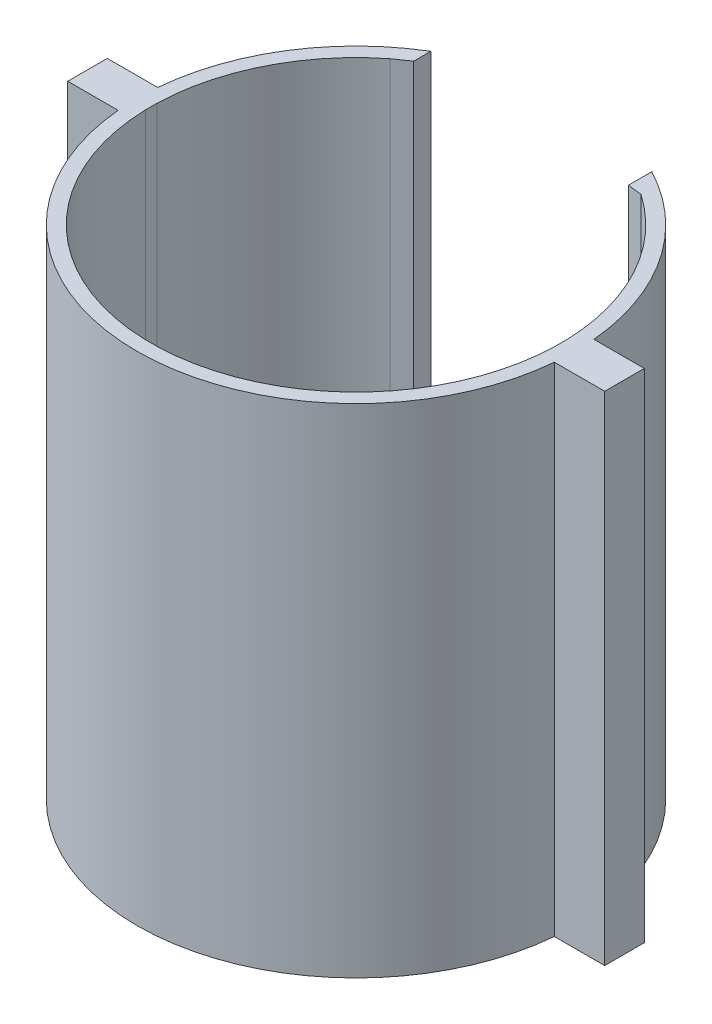
ISO-10303-21;
HEADER;
FILE_DESCRIPTION(('STEP AP214'),'2;1');
FILE_NAME('part.step','',(''),(''),'','','');
FILE_SCHEMA(('AUTOMOTIVE_DESIGN { 1 0 10303 214 1 1 1 1 }'));
ENDSEC;
DATA;
#1=APPLICATION_CONTEXT('core data for automotive mechanical design processes');
#2=APPLICATION_PROTOCOL_DEFINITION('international standard','automotive_design',2000,#1);
#3=PRODUCT_CONTEXT('',#1,'mechanical');
#4=PRODUCT('Part','Part','',(#3));
#5=PRODUCT_RELATED_PRODUCT_CATEGORY('part','',(#4));
#6=PRODUCT_DEFINITION_FORMATION('','',#4);
#7=PRODUCT_DEFINITION_CONTEXT('part definition',#1,'design');
#8=PRODUCT_DEFINITION('design','',#6,#7);
#9=PRODUCT_DEFINITION_SHAPE('','',#8);
#10=(LENGTH_UNIT() NAMED_UNIT(*) SI_UNIT(.MILLI.,.METRE.));
#11=(NAMED_UNIT(*) PLANE_ANGLE_UNIT() SI_UNIT($,.RADIAN.));
#12=(NAMED_UNIT(*) SI_UNIT($,.STERADIAN.) SOLID_ANGLE_UNIT());
#13=UNCERTAINTY_MEASURE_WITH_UNIT(LENGTH_MEASURE(1.E-05),#10,'distance_accuracy_value','');
#14=(GEOMETRIC_REPRESENTATION_CONTEXT(3) GLOBAL_UNCERTAINTY_ASSIGNED_CONTEXT((#13)) GLOBAL_UNIT_ASSIGNED_CONTEXT((#10,
#11,#12)) REPRESENTATION_CONTEXT('',''));
#15=CARTESIAN_POINT('',(0.,0.,0.));
#16=DIRECTION('',(0.,0.,1.));
#17=DIRECTION('',(1.,0.,0.));
#18=AXIS2_PLACEMENT_3D('',#15,#16,#17);
#19=CARTESIAN_POINT('',(0.,44.704,0.));
#20=DIRECTION('',(0.,-1.,0.));
#21=DIRECTION('',(0.,0.,-1.));
#22=AXIS2_PLACEMENT_3D('',#19,#20,#21);
#23=CYLINDRICAL_SURFACE('',#22,19.685);
#24=CARTESIAN_POINT('',(0.,0.,0.));
#25=DIRECTION('',(0.,1.,0.));
#26=DIRECTION('',(0.,0.,1.));
#27=AXIS2_PLACEMENT_3D('',#24,#25,#26);
#28=CIRCLE('',#27,19.685);
#29=CARTESIAN_POINT('',(-19.6045387856996,0.,1.778));
#30=VERTEX_POINT('',#29);
#31=CARTESIAN_POINT('',(19.6045387856996,0.,1.778));
#32=VERTEX_POINT('',#31);
#33=EDGE_CURVE('E268',#30,#32,#28,.T.);
#34=ORIENTED_EDGE('',*,*,#33,.T.);
#35=DIRECTION('',(0.,-1.,0.));
#36=VECTOR('',#35,1.);
#37=CARTESIAN_POINT('',(19.6045387856996,44.704,1.778));
#38=LINE('',#37,#36);
#39=CARTESIAN_POINT('',(19.6045387856996,44.704,1.778));
#40=VERTEX_POINT('',#39);
#41=EDGE_CURVE('E11',#40,#32,#38,.T.);
#42=ORIENTED_EDGE('',*,*,#41,.F.);
#43=CARTESIAN_POINT('',(0.,44.704,0.));
#44=DIRECTION('',(0.,1.,0.));
#45=DIRECTION('',(0.,0.,1.));
#46=AXIS2_PLACEMENT_3D('',#43,#44,#45);
#47=CIRCLE('',#46,19.685);
#48=CARTESIAN_POINT('',(-19.6045387856996,44.704,1.778));
#49=VERTEX_POINT('',#48);
#50=EDGE_CURVE('E223',#49,#40,#47,.T.);
#51=ORIENTED_EDGE('',*,*,#50,.F.);
#52=DIRECTION('',(0.,-1.,0.));
#53=VECTOR('',#52,1.);
#54=CARTESIAN_POINT('',(-19.6045387856996,44.704,1.778));
#55=LINE('',#54,#53);
#56=EDGE_CURVE('E224',#49,#30,#55,.T.);
#57=ORIENTED_EDGE('',*,*,#56,.T.);
#58=EDGE_LOOP('',(#34,#42,#51,#57));
#59=FACE_BOUND('',#58,.T.);
#60=ADVANCED_FACE('F47',(#59),#23,.T.);
#61=CARTESIAN_POINT('',(0.,44.704,1.778));
#62=DIRECTION('',(0.,0.,-1.));
#63=DIRECTION('',(-1.,0.,0.));
#64=AXIS2_PLACEMENT_3D('',#61,#62,#63);
#65=PLANE('',#64);
#66=DIRECTION('',(1.,0.,0.));
#67=VECTOR('',#66,1.);
#68=CARTESIAN_POINT('',(0.,0.,1.778));
#69=LINE('',#68,#67);
#70=CARTESIAN_POINT('',(24.13,0.,1.778));
#71=VERTEX_POINT('',#70);
#72=EDGE_CURVE('E262',#32,#71,#69,.T.);
#73=ORIENTED_EDGE('',*,*,#72,.T.);
#74=DIRECTION('',(0.,-1.,0.));
#75=VECTOR('',#74,1.);
#76=CARTESIAN_POINT('',(24.13,44.704,1.778));
#77=LINE('',#76,#75);
#78=CARTESIAN_POINT('',(24.13,44.704,1.778));
#79=VERTEX_POINT('',#78);
#80=EDGE_CURVE('E55',#79,#71,#77,.T.);
#81=ORIENTED_EDGE('',*,*,#80,.F.);
#82=DIRECTION('',(1.,0.,0.));
#83=VECTOR('',#82,1.);
#84=CARTESIAN_POINT('',(0.,44.704,1.778));
#85=LINE('',#84,#83);
#86=EDGE_CURVE('E302',#40,#79,#85,.T.);
#87=ORIENTED_EDGE('',*,*,#86,.F.);
#88=ORIENTED_EDGE('',*,*,#41,.T.);
#89=EDGE_LOOP('',(#73,#81,#87,#88));
#90=FACE_BOUND('',#89,.T.);
#91=ADVANCED_FACE('F406',(#90),#65,.F.);
#92=CARTESIAN_POINT('',(24.13,44.704,0.));
#93=DIRECTION('',(-1.,0.,0.));
#94=DIRECTION('',(0.,0.,1.));
#95=AXIS2_PLACEMENT_3D('',#92,#93,#94);
#96=PLANE('',#95);
#97=DIRECTION('',(0.,0.,-1.));
#98=VECTOR('',#97,1.);
#99=CARTESIAN_POINT('',(24.13,0.,0.));
#100=LINE('',#99,#98);
#101=CARTESIAN_POINT('',(24.13,0.,-1.778));
#102=VERTEX_POINT('',#101);
#103=EDGE_CURVE('E257',#71,#102,#100,.T.);
#104=ORIENTED_EDGE('',*,*,#103,.T.);
#105=DIRECTION('',(0.,-1.,0.));
#106=VECTOR('',#105,1.);
#107=CARTESIAN_POINT('',(24.13,44.704,-1.778));
#108=LINE('',#107,#106);
#109=CARTESIAN_POINT('',(24.13,44.704,-1.778));
#110=VERTEX_POINT('',#109);
#111=EDGE_CURVE('E246',#110,#102,#108,.T.);
#112=ORIENTED_EDGE('',*,*,#111,.F.);
#113=DIRECTION('',(0.,0.,-1.));
#114=VECTOR('',#113,1.);
#115=CARTESIAN_POINT('',(24.13,44.704,0.));
#116=LINE('',#115,#114);
#117=EDGE_CURVE('E259',#79,#110,#116,.T.);
#118=ORIENTED_EDGE('',*,*,#117,.F.);
#119=ORIENTED_EDGE('',*,*,#80,.T.);
#120=EDGE_LOOP('',(#104,#112,#118,#119));
#121=FACE_BOUND('',#120,.T.);
#122=ADVANCED_FACE('F255',(#121),#96,.F.);
#123=CARTESIAN_POINT('',(0.,44.704,-1.778));
#124=DIRECTION('',(0.,0.,-1.));
#125=DIRECTION('',(-1.,0.,0.));
#126=AXIS2_PLACEMENT_3D('',#123,#124,#125);
#127=PLANE('',#126);
#128=DIRECTION('',(1.,0.,0.));
#129=VECTOR('',#128,1.);
#130=CARTESIAN_POINT('',(0.,0.,-1.778));
#131=LINE('',#130,#129);
#132=CARTESIAN_POINT('',(19.6045387856996,0.,-1.778));
#133=VERTEX_POINT('',#132);
#134=EDGE_CURVE('E208',#133,#102,#131,.T.);
#135=ORIENTED_EDGE('',*,*,#134,.F.);
#136=DIRECTION('',(0.,-1.,0.));
#137=VECTOR('',#136,1.);
#138=CARTESIAN_POINT('',(19.6045387856996,44.704,-1.778));
#139=LINE('',#138,#137);
#140=CARTESIAN_POINT('',(19.6045387856996,44.704,-1.778));
#141=VERTEX_POINT('',#140);
#142=EDGE_CURVE('E243',#141,#133,#139,.T.);
#143=ORIENTED_EDGE('',*,*,#142,.F.);
#144=DIRECTION('',(1.,0.,0.));
#145=VECTOR('',#144,1.);
#146=CARTESIAN_POINT('',(0.,44.704,-1.778));
#147=LINE('',#146,#145);
#148=EDGE_CURVE('E296',#141,#110,#147,.T.);
#149=ORIENTED_EDGE('',*,*,#148,.T.);
#150=ORIENTED_EDGE('',*,*,#111,.T.);
#151=EDGE_LOOP('',(#135,#143,#149,#150));
#152=FACE_BOUND('',#151,.T.);
#153=ADVANCED_FACE('F397',(#152),#127,.T.);
#154=CARTESIAN_POINT('',(0.,44.704,0.));
#155=DIRECTION('',(0.,-1.,0.));
#156=DIRECTION('',(0.,0.,-1.));
#157=AXIS2_PLACEMENT_3D('',#154,#155,#156);
#158=CYLINDRICAL_SURFACE('',#157,19.685);
#159=CARTESIAN_POINT('',(0.,0.,0.));
#160=DIRECTION('',(0.,1.,0.));
#161=DIRECTION('',(0.,0.,1.));
#162=AXIS2_PLACEMENT_3D('',#159,#160,#161);
#163=CIRCLE('',#162,19.685);
#164=CARTESIAN_POINT('',(9.15893131399782,0.,-17.4245000555388));
#165=VERTEX_POINT('',#164);
#166=EDGE_CURVE('E202',#133,#165,#163,.T.);
#167=ORIENTED_EDGE('',*,*,#166,.T.);
#168=DIRECTION('',(0.,-1.,0.));
#169=VECTOR('',#168,1.);
#170=CARTESIAN_POINT('',(9.15893131399782,44.704,-17.4245000555388));
#171=LINE('',#170,#169);
#172=CARTESIAN_POINT('',(9.15893131399782,44.704,-17.4245000555388));
#173=VERTEX_POINT('',#172);
#174=EDGE_CURVE('E199',#173,#165,#171,.T.);
#175=ORIENTED_EDGE('',*,*,#174,.F.);
#176=CARTESIAN_POINT('',(0.,44.704,0.));
#177=DIRECTION('',(0.,1.,0.));
#178=DIRECTION('',(0.,0.,1.));
#179=AXIS2_PLACEMENT_3D('',#176,#177,#178);
#180=CIRCLE('',#179,19.685);
#181=EDGE_CURVE('E293',#141,#173,#180,.T.);
#182=ORIENTED_EDGE('',*,*,#181,.F.);
#183=ORIENTED_EDGE('',*,*,#142,.T.);
#184=EDGE_LOOP('',(#167,#175,#182,#183));
#185=FACE_BOUND('',#184,.T.);
#186=ADVANCED_FACE('F395',(#185),#158,.T.);
#187=CARTESIAN_POINT('',(9.15893131399782,44.704,0.));
#188=DIRECTION('',(1.,0.,0.));
#189=DIRECTION('',(0.,0.,-1.));
#190=AXIS2_PLACEMENT_3D('',#187,#188,#189);
#191=PLANE('',#190);
#192=DIRECTION('',(0.,0.,1.));
#193=VECTOR('',#192,1.);
#194=CARTESIAN_POINT('',(9.15893131399782,0.,0.));
#195=LINE('',#194,#193);
#196=CARTESIAN_POINT('',(9.15893131399782,0.,-15.3342891279983));
#197=VERTEX_POINT('',#196);
#198=EDGE_CURVE('E191',#165,#197,#195,.T.);
#199=ORIENTED_EDGE('',*,*,#198,.T.);
#200=DIRECTION('',(0.,1.,0.));
#201=VECTOR('',#200,1.);
#202=CARTESIAN_POINT('',(9.15893131399782,0.,-15.3342891279983));
#203=LINE('',#202,#201);
#204=CARTESIAN_POINT('',(9.15893131399782,44.704,-15.3342891279983));
#205=VERTEX_POINT('',#204);
#206=EDGE_CURVE('E172',#197,#205,#203,.T.);
#207=ORIENTED_EDGE('',*,*,#206,.T.);
#208=DIRECTION('',(0.,0.,1.));
#209=VECTOR('',#208,1.);
#210=CARTESIAN_POINT('',(9.15893131399782,44.704,0.));
#211=LINE('',#210,#209);
#212=EDGE_CURVE('E290',#173,#205,#211,.T.);
#213=ORIENTED_EDGE('',*,*,#212,.F.);
#214=ORIENTED_EDGE('',*,*,#174,.T.);
#215=EDGE_LOOP('',(#199,#207,#213,#214));
#216=FACE_BOUND('',#215,.T.);
#217=ADVANCED_FACE('F197',(#216),#191,.F.);
#218=CARTESIAN_POINT('',(-10.1450686860022,44.704,0.));
#219=DIRECTION('',(1.,0.,0.));
#220=DIRECTION('',(0.,0.,-1.));
#221=AXIS2_PLACEMENT_3D('',#218,#219,#220);
#222=PLANE('',#221);
#223=DIRECTION('',(0.,1.,0.));
#224=VECTOR('',#223,1.);
#225=CARTESIAN_POINT('',(-10.1450686860022,0.,-15.3342891279983));
#226=LINE('',#225,#224);
#227=CARTESIAN_POINT('',(-10.1450686860022,0.,-15.3342891279983));
#228=VERTEX_POINT('',#227);
#229=CARTESIAN_POINT('',(-10.1450686860022,44.704,-15.3342891279983));
#230=VERTEX_POINT('',#229);
#231=EDGE_CURVE('E183',#228,#230,#226,.T.);
#232=ORIENTED_EDGE('',*,*,#231,.F.);
#233=DIRECTION('',(0.,0.,1.));
#234=VECTOR('',#233,1.);
#235=CARTESIAN_POINT('',(-10.1450686860022,0.,0.));
#236=LINE('',#235,#234);
#237=CARTESIAN_POINT('',(-10.1450686860022,0.,-16.8694044458095));
#238=VERTEX_POINT('',#237);
#239=EDGE_CURVE('E201',#238,#228,#236,.T.);
#240=ORIENTED_EDGE('',*,*,#239,.F.);
#241=DIRECTION('',(0.,-1.,0.));
#242=VECTOR('',#241,1.);
#243=CARTESIAN_POINT('',(-10.1450686860022,44.704,-16.8694044458095));
#244=LINE('',#243,#242);
#245=CARTESIAN_POINT('',(-10.1450686860022,44.704,-16.8694044458095));
#246=VERTEX_POINT('',#245);
#247=EDGE_CURVE('E238',#246,#238,#244,.T.);
#248=ORIENTED_EDGE('',*,*,#247,.F.);
#249=DIRECTION('',(0.,0.,1.));
#250=VECTOR('',#249,1.);
#251=CARTESIAN_POINT('',(-10.1450686860022,44.704,0.));
#252=LINE('',#251,#250);
#253=EDGE_CURVE('E286',#246,#230,#252,.T.);
#254=ORIENTED_EDGE('',*,*,#253,.T.);
#255=EDGE_LOOP('',(#232,#240,#248,#254));
#256=FACE_BOUND('',#255,.T.);
#257=ADVANCED_FACE('F433',(#256),#222,.T.);
#258=CARTESIAN_POINT('',(-19.6045387856996,0.,-1.778));
#259=VERTEX_POINT('',#258);
#260=EDGE_CURVE('E206',#238,#259,#163,.T.);
#261=ORIENTED_EDGE('',*,*,#260,.T.);
#262=DIRECTION('',(0.,-1.,0.));
#263=VECTOR('',#262,1.);
#264=CARTESIAN_POINT('',(-19.6045387856996,44.704,-1.778));
#265=LINE('',#264,#263);
#266=CARTESIAN_POINT('',(-19.6045387856996,44.704,-1.778));
#267=VERTEX_POINT('',#266);
#268=EDGE_CURVE('E235',#267,#259,#265,.T.);
#269=ORIENTED_EDGE('',*,*,#268,.F.);
#270=EDGE_CURVE('E285',#246,#267,#180,.T.);
#271=ORIENTED_EDGE('',*,*,#270,.F.);
#272=ORIENTED_EDGE('',*,*,#247,.T.);
#273=EDGE_LOOP('',(#261,#269,#271,#272));
#274=FACE_BOUND('',#273,.T.);
#275=ADVANCED_FACE('F405',(#274),#158,.T.);
#276=CARTESIAN_POINT('',(0.,44.704,-1.778));
#277=DIRECTION('',(0.,0.,-1.));
#278=DIRECTION('',(-1.,0.,0.));
#279=AXIS2_PLACEMENT_3D('',#276,#277,#278);
#280=PLANE('',#279);
#281=DIRECTION('',(1.,0.,0.));
#282=VECTOR('',#281,1.);
#283=CARTESIAN_POINT('',(0.,0.,-1.778));
#284=LINE('',#283,#282);
#285=CARTESIAN_POINT('',(-24.13,0.,-1.778));
#286=VERTEX_POINT('',#285);
#287=EDGE_CURVE('E212',#286,#259,#284,.T.);
#288=ORIENTED_EDGE('',*,*,#287,.F.);
#289=DIRECTION('',(0.,-1.,0.));
#290=VECTOR('',#289,1.);
#291=CARTESIAN_POINT('',(-24.13,44.704,-1.778));
#292=LINE('',#291,#290);
#293=CARTESIAN_POINT('',(-24.13,44.704,-1.778));
#294=VERTEX_POINT('',#293);
#295=EDGE_CURVE('E232',#294,#286,#292,.T.);
#296=ORIENTED_EDGE('',*,*,#295,.F.);
#297=DIRECTION('',(1.,0.,0.));
#298=VECTOR('',#297,1.);
#299=CARTESIAN_POINT('',(0.,44.704,-1.778));
#300=LINE('',#299,#298);
#301=EDGE_CURVE('E281',#294,#267,#300,.T.);
#302=ORIENTED_EDGE('',*,*,#301,.T.);
#303=ORIENTED_EDGE('',*,*,#268,.T.);
#304=EDGE_LOOP('',(#288,#296,#302,#303));
#305=FACE_BOUND('',#304,.T.);
#306=ADVANCED_FACE('F427',(#305),#280,.T.);
#307=CARTESIAN_POINT('',(-24.13,44.704,0.));
#308=DIRECTION('',(-1.,0.,0.));
#309=DIRECTION('',(0.,0.,1.));
#310=AXIS2_PLACEMENT_3D('',#307,#308,#309);
#311=PLANE('',#310);
#312=DIRECTION('',(0.,0.,-1.));
#313=VECTOR('',#312,1.);
#314=CARTESIAN_POINT('',(-24.13,0.,0.));
#315=LINE('',#314,#313);
#316=CARTESIAN_POINT('',(-24.13,0.,1.778));
#317=VERTEX_POINT('',#316);
#318=EDGE_CURVE('E216',#317,#286,#315,.T.);
#319=ORIENTED_EDGE('',*,*,#318,.F.);
#320=DIRECTION('',(0.,-1.,0.));
#321=VECTOR('',#320,1.);
#322=CARTESIAN_POINT('',(-24.13,44.704,1.778));
#323=LINE('',#322,#321);
#324=CARTESIAN_POINT('',(-24.13,44.704,1.778));
#325=VERTEX_POINT('',#324);
#326=EDGE_CURVE('E228',#325,#317,#323,.T.);
#327=ORIENTED_EDGE('',*,*,#326,.F.);
#328=DIRECTION('',(0.,0.,-1.));
#329=VECTOR('',#328,1.);
#330=CARTESIAN_POINT('',(-24.13,44.704,0.));
#331=LINE('',#330,#329);
#332=EDGE_CURVE('E277',#325,#294,#331,.T.);
#333=ORIENTED_EDGE('',*,*,#332,.T.);
#334=ORIENTED_EDGE('',*,*,#295,.T.);
#335=EDGE_LOOP('',(#319,#327,#333,#334));
#336=FACE_BOUND('',#335,.T.);
#337=ADVANCED_FACE('F421',(#336),#311,.T.);
#338=CARTESIAN_POINT('',(0.,44.704,1.778));
#339=DIRECTION('',(0.,0.,-1.));
#340=DIRECTION('',(-1.,0.,0.));
#341=AXIS2_PLACEMENT_3D('',#338,#339,#340);
#342=PLANE('',#341);
#343=DIRECTION('',(1.,0.,0.));
#344=VECTOR('',#343,1.);
#345=CARTESIAN_POINT('',(0.,0.,1.778));
#346=LINE('',#345,#344);
#347=EDGE_CURVE('E220',#317,#30,#346,.T.);
#348=ORIENTED_EDGE('',*,*,#347,.T.);
#349=ORIENTED_EDGE('',*,*,#56,.F.);
#350=DIRECTION('',(1.,0.,0.));
#351=VECTOR('',#350,1.);
#352=CARTESIAN_POINT('',(0.,44.704,1.778));
#353=LINE('',#352,#351);
#354=EDGE_CURVE('E229',#325,#49,#353,.T.);
#355=ORIENTED_EDGE('',*,*,#354,.F.);
#356=ORIENTED_EDGE('',*,*,#326,.T.);
#357=EDGE_LOOP('',(#348,#349,#355,#356));
#358=FACE_BOUND('',#357,.T.);
#359=ADVANCED_FACE('F466',(#358),#342,.F.);
#360=CARTESIAN_POINT('',(0.,44.704,0.));
#361=DIRECTION('',(0.,1.,0.));
#362=DIRECTION('',(0.,0.,1.));
#363=AXIS2_PLACEMENT_3D('',#360,#361,#362);
#364=PLANE('',#363);
#365=DIRECTION('',(-0.820721689293798,0.,0.571328197031036));
#366=VECTOR('',#365,1.);
#367=CARTESIAN_POINT('',(-11.4150686860022,44.704,-14.4502052543849));
#368=LINE('',#367,#366);
#369=CARTESIAN_POINT('',(-11.4150686860022,44.704,-14.4502052543849));
#370=VERTEX_POINT('',#369);
#371=EDGE_CURVE('E194',#230,#370,#368,.T.);
#372=ORIENTED_EDGE('',*,*,#371,.F.);
#373=ORIENTED_EDGE('',*,*,#253,.F.);
#374=ORIENTED_EDGE('',*,*,#270,.T.);
#375=ORIENTED_EDGE('',*,*,#301,.F.);
#376=ORIENTED_EDGE('',*,*,#332,.F.);
#377=ORIENTED_EDGE('',*,*,#354,.T.);
#378=ORIENTED_EDGE('',*,*,#50,.T.);
#379=ORIENTED_EDGE('',*,*,#86,.T.);
#380=ORIENTED_EDGE('',*,*,#117,.T.);
#381=ORIENTED_EDGE('',*,*,#148,.F.);
#382=ORIENTED_EDGE('',*,*,#181,.T.);
#383=ORIENTED_EDGE('',*,*,#212,.T.);
#384=DIRECTION('',(-0.992443744325037,0.,-0.122700506723084));
#385=VECTOR('',#384,1.);
#386=CARTESIAN_POINT('',(9.15893131399782,44.704,-15.3342891279983));
#387=LINE('',#386,#385);
#388=CARTESIAN_POINT('',(10.4289313139978,44.704,-15.1772730306836));
#389=VERTEX_POINT('',#388);
#390=EDGE_CURVE('E177',#389,#205,#387,.T.);
#391=ORIENTED_EDGE('',*,*,#390,.F.);
#392=CARTESIAN_POINT('',(0.,44.704,0.));
#393=DIRECTION('',(0.,1.,0.));
#394=DIRECTION('',(0.,0.,1.));
#395=AXIS2_PLACEMENT_3D('',#392,#393,#394);
#396=CIRCLE('',#395,18.415);
#397=CARTESIAN_POINT('',(18.4079917698808,44.704,-0.508000000000002));
#398=VERTEX_POINT('',#397);
#399=EDGE_CURVE('E336',#398,#389,#396,.T.);
#400=ORIENTED_EDGE('',*,*,#399,.F.);
#401=DIRECTION('',(0.,0.,-1.));
#402=VECTOR('',#401,1.);
#403=CARTESIAN_POINT('',(18.4079917698808,44.704,-0.508));
#404=LINE('',#403,#402);
#405=CARTESIAN_POINT('',(18.4079917698808,44.704,0.508));
#406=VERTEX_POINT('',#405);
#407=EDGE_CURVE('E340',#406,#398,#404,.T.);
#408=ORIENTED_EDGE('',*,*,#407,.F.);
#409=CARTESIAN_POINT('',(0.,44.704,0.));
#410=DIRECTION('',(0.,1.,0.));
#411=DIRECTION('',(0.,0.,1.));
#412=AXIS2_PLACEMENT_3D('',#409,#410,#411);
#413=CIRCLE('',#412,18.415);
#414=CARTESIAN_POINT('',(-18.4079917698808,44.704,0.508));
#415=VERTEX_POINT('',#414);
#416=EDGE_CURVE('E62',#415,#406,#413,.T.);
#417=ORIENTED_EDGE('',*,*,#416,.F.);
#418=DIRECTION('',(0.,0.,1.));
#419=VECTOR('',#418,1.);
#420=CARTESIAN_POINT('',(-18.4079917698808,44.704,-0.508));
#421=LINE('',#420,#419);
#422=CARTESIAN_POINT('',(-18.4079917698808,44.704,-0.508));
#423=VERTEX_POINT('',#422);
#424=EDGE_CURVE('E327',#423,#415,#421,.T.);
#425=ORIENTED_EDGE('',*,*,#424,.F.);
#426=CARTESIAN_POINT('',(0.,44.704,0.));
#427=DIRECTION('',(0.,1.,0.));
#428=DIRECTION('',(0.,0.,1.));
#429=AXIS2_PLACEMENT_3D('',#426,#427,#428);
#430=CIRCLE('',#429,18.415);
#431=EDGE_CURVE('E332',#370,#423,#430,.T.);
#432=ORIENTED_EDGE('',*,*,#431,.F.);
#433=EDGE_LOOP('',(#372,#373,#374,#375,#376,#377,#378,#379,#380,#381,#382,#383,#391,#400,#408,
#417,#425,#432));
#434=FACE_BOUND('',#433,.T.);
#435=ADVANCED_FACE('F391',(#434),#364,.T.);
#436=CARTESIAN_POINT('',(0.,0.,0.));
#437=DIRECTION('',(0.,1.,0.));
#438=DIRECTION('',(0.,0.,1.));
#439=AXIS2_PLACEMENT_3D('',#436,#437,#438);
#440=PLANE('',#439);
#441=ORIENTED_EDGE('',*,*,#239,.T.);
#442=DIRECTION('',(-0.820721689293798,0.,0.571328197031036));
#443=VECTOR('',#442,1.);
#444=CARTESIAN_POINT('',(-11.4150686860022,0.,-14.4502052543849));
#445=LINE('',#444,#443);
#446=CARTESIAN_POINT('',(-11.4150686860022,0.,-14.4502052543849));
#447=VERTEX_POINT('',#446);
#448=EDGE_CURVE('E184',#228,#447,#445,.T.);
#449=ORIENTED_EDGE('',*,*,#448,.T.);
#450=CARTESIAN_POINT('',(0.,0.,0.));
#451=DIRECTION('',(0.,1.,0.));
#452=DIRECTION('',(0.,0.,1.));
#453=AXIS2_PLACEMENT_3D('',#450,#451,#452);
#454=CIRCLE('',#453,18.415);
#455=CARTESIAN_POINT('',(-18.4079917698808,0.,-0.508));
#456=VERTEX_POINT('',#455);
#457=EDGE_CURVE('E349',#447,#456,#454,.T.);
#458=ORIENTED_EDGE('',*,*,#457,.T.);
#459=DIRECTION('',(0.,0.,1.));
#460=VECTOR('',#459,1.);
#461=CARTESIAN_POINT('',(-18.4079917698808,0.,-0.508));
#462=LINE('',#461,#460);
#463=CARTESIAN_POINT('',(-18.4079917698808,0.,0.508));
#464=VERTEX_POINT('',#463);
#465=EDGE_CURVE('E312',#456,#464,#462,.T.);
#466=ORIENTED_EDGE('',*,*,#465,.T.);
#467=CARTESIAN_POINT('',(0.,0.,0.));
#468=DIRECTION('',(0.,1.,0.));
#469=DIRECTION('',(0.,0.,1.));
#470=AXIS2_PLACEMENT_3D('',#467,#468,#469);
#471=CIRCLE('',#470,18.415);
#472=CARTESIAN_POINT('',(18.4079917698808,0.,0.508));
#473=VERTEX_POINT('',#472);
#474=EDGE_CURVE('E331',#464,#473,#471,.T.);
#475=ORIENTED_EDGE('',*,*,#474,.T.);
#476=DIRECTION('',(0.,0.,-1.));
#477=VECTOR('',#476,1.);
#478=CARTESIAN_POINT('',(18.4079917698808,0.,-0.508));
#479=LINE('',#478,#477);
#480=CARTESIAN_POINT('',(18.4079917698808,0.,-0.508000000000002));
#481=VERTEX_POINT('',#480);
#482=EDGE_CURVE('E355',#473,#481,#479,.T.);
#483=ORIENTED_EDGE('',*,*,#482,.T.);
#484=CARTESIAN_POINT('',(0.,0.,0.));
#485=DIRECTION('',(0.,1.,0.));
#486=DIRECTION('',(0.,0.,1.));
#487=AXIS2_PLACEMENT_3D('',#484,#485,#486);
#488=CIRCLE('',#487,18.415);
#489=CARTESIAN_POINT('',(10.4289313139978,0.,-15.1772730306836));
#490=VERTEX_POINT('',#489);
#491=EDGE_CURVE('E70',#481,#490,#488,.T.);
#492=ORIENTED_EDGE('',*,*,#491,.T.);
#493=DIRECTION('',(-0.992443744325037,0.,-0.122700506723084));
#494=VECTOR('',#493,1.);
#495=CARTESIAN_POINT('',(9.15893131399782,0.,-15.3342891279983));
#496=LINE('',#495,#494);
#497=EDGE_CURVE('E175',#490,#197,#496,.T.);
#498=ORIENTED_EDGE('',*,*,#497,.T.);
#499=ORIENTED_EDGE('',*,*,#198,.F.);
#500=ORIENTED_EDGE('',*,*,#166,.F.);
#501=ORIENTED_EDGE('',*,*,#134,.T.);
#502=ORIENTED_EDGE('',*,*,#103,.F.);
#503=ORIENTED_EDGE('',*,*,#72,.F.);
#504=ORIENTED_EDGE('',*,*,#33,.F.);
#505=ORIENTED_EDGE('',*,*,#347,.F.);
#506=ORIENTED_EDGE('',*,*,#318,.T.);
#507=ORIENTED_EDGE('',*,*,#287,.T.);
#508=ORIENTED_EDGE('',*,*,#260,.F.);
#509=EDGE_LOOP('',(#441,#449,#458,#466,#475,#483,#492,#498,#499,#500,#501,#502,#503,#504,#505,
#506,#507,#508));
#510=FACE_BOUND('',#509,.T.);
#511=ADVANCED_FACE('F189',(#510),#440,.F.);
#512=CARTESIAN_POINT('',(0.,0.,0.));
#513=DIRECTION('',(0.,1.,0.));
#514=DIRECTION('',(0.,0.,1.));
#515=AXIS2_PLACEMENT_3D('',#512,#513,#514);
#516=CYLINDRICAL_SURFACE('',#515,18.415);
#517=ORIENTED_EDGE('',*,*,#416,.T.);
#518=DIRECTION('',(0.,1.,0.));
#519=VECTOR('',#518,1.);
#520=CARTESIAN_POINT('',(18.4079917698808,0.,0.508));
#521=LINE('',#520,#519);
#522=EDGE_CURVE('E308',#473,#406,#521,.T.);
#523=ORIENTED_EDGE('',*,*,#522,.F.);
#524=ORIENTED_EDGE('',*,*,#474,.F.);
#525=DIRECTION('',(0.,1.,0.));
#526=VECTOR('',#525,1.);
#527=CARTESIAN_POINT('',(-18.4079917698808,0.,0.508));
#528=LINE('',#527,#526);
#529=EDGE_CURVE('E274',#464,#415,#528,.T.);
#530=ORIENTED_EDGE('',*,*,#529,.T.);
#531=EDGE_LOOP('',(#517,#523,#524,#530));
#532=FACE_BOUND('',#531,.T.);
#533=ADVANCED_FACE('F383',(#532),#516,.F.);
#534=CARTESIAN_POINT('',(-18.4079917698808,0.,-0.508));
#535=DIRECTION('',(-1.,0.,0.));
#536=DIRECTION('',(0.,0.,1.));
#537=AXIS2_PLACEMENT_3D('',#534,#535,#536);
#538=PLANE('',#537);
#539=ORIENTED_EDGE('',*,*,#424,.T.);
#540=ORIENTED_EDGE('',*,*,#529,.F.);
#541=ORIENTED_EDGE('',*,*,#465,.F.);
#542=DIRECTION('',(0.,1.,0.));
#543=VECTOR('',#542,1.);
#544=CARTESIAN_POINT('',(-18.4079917698808,0.,-0.508));
#545=LINE('',#544,#543);
#546=EDGE_CURVE('E322',#456,#423,#545,.T.);
#547=ORIENTED_EDGE('',*,*,#546,.T.);
#548=EDGE_LOOP('',(#539,#540,#541,#547));
#549=FACE_BOUND('',#548,.T.);
#550=ADVANCED_FACE('F380',(#549),#538,.F.);
#551=CARTESIAN_POINT('',(0.,0.,0.));
#552=DIRECTION('',(0.,1.,0.));
#553=DIRECTION('',(0.,0.,1.));
#554=AXIS2_PLACEMENT_3D('',#551,#552,#553);
#555=CYLINDRICAL_SURFACE('',#554,18.415);
#556=ORIENTED_EDGE('',*,*,#431,.T.);
#557=ORIENTED_EDGE('',*,*,#546,.F.);
#558=ORIENTED_EDGE('',*,*,#457,.F.);
#559=DIRECTION('',(0.,1.,0.));
#560=VECTOR('',#559,1.);
#561=CARTESIAN_POINT('',(-11.4150686860022,0.,-14.4502052543849));
#562=LINE('',#561,#560);
#563=EDGE_CURVE('E318',#447,#370,#562,.T.);
#564=ORIENTED_EDGE('',*,*,#563,.T.);
#565=EDGE_LOOP('',(#556,#557,#558,#564));
#566=FACE_BOUND('',#565,.T.);
#567=ADVANCED_FACE('F375',(#566),#555,.F.);
#568=CARTESIAN_POINT('',(0.,0.,0.));
#569=DIRECTION('',(0.,1.,0.));
#570=DIRECTION('',(0.,0.,1.));
#571=AXIS2_PLACEMENT_3D('',#568,#569,#570);
#572=CYLINDRICAL_SURFACE('',#571,18.415);
#573=ORIENTED_EDGE('',*,*,#399,.T.);
#574=DIRECTION('',(0.,1.,0.));
#575=VECTOR('',#574,1.);
#576=CARTESIAN_POINT('',(10.4289313139978,0.,-15.1772730306836));
#577=LINE('',#576,#575);
#578=EDGE_CURVE('E315',#490,#389,#577,.T.);
#579=ORIENTED_EDGE('',*,*,#578,.F.);
#580=ORIENTED_EDGE('',*,*,#491,.F.);
#581=DIRECTION('',(0.,1.,0.));
#582=VECTOR('',#581,1.);
#583=CARTESIAN_POINT('',(18.4079917698808,0.,-0.508000000000002));
#584=LINE('',#583,#582);
#585=EDGE_CURVE('E311',#481,#398,#584,.T.);
#586=ORIENTED_EDGE('',*,*,#585,.T.);
#587=EDGE_LOOP('',(#573,#579,#580,#586));
#588=FACE_BOUND('',#587,.T.);
#589=ADVANCED_FACE('F388',(#588),#572,.F.);
#590=CARTESIAN_POINT('',(18.4079917698808,0.,-0.508));
#591=DIRECTION('',(1.,0.,0.));
#592=DIRECTION('',(0.,0.,-1.));
#593=AXIS2_PLACEMENT_3D('',#590,#591,#592);
#594=PLANE('',#593);
#595=ORIENTED_EDGE('',*,*,#407,.T.);
#596=ORIENTED_EDGE('',*,*,#585,.F.);
#597=ORIENTED_EDGE('',*,*,#482,.F.);
#598=ORIENTED_EDGE('',*,*,#522,.T.);
#599=EDGE_LOOP('',(#595,#596,#597,#598));
#600=FACE_BOUND('',#599,.T.);
#601=ADVANCED_FACE('F386',(#600),#594,.F.);
#602=CARTESIAN_POINT('',(9.15893131399782,0.,-15.3342891279983));
#603=DIRECTION('',(0.122700506723084,0.,-0.992443744325037));
#604=DIRECTION('',(-0.992443744325037,0.,-0.122700506723084));
#605=AXIS2_PLACEMENT_3D('',#602,#603,#604);
#606=PLANE('',#605);
#607=ORIENTED_EDGE('',*,*,#390,.T.);
#608=ORIENTED_EDGE('',*,*,#206,.F.);
#609=ORIENTED_EDGE('',*,*,#497,.F.);
#610=ORIENTED_EDGE('',*,*,#578,.T.);
#611=EDGE_LOOP('',(#607,#608,#609,#610));
#612=FACE_BOUND('',#611,.T.);
#613=ADVANCED_FACE('F174',(#612),#606,.F.);
#614=CARTESIAN_POINT('',(-11.4150686860022,0.,-14.4502052543849));
#615=DIRECTION('',(-0.571328197031036,0.,-0.820721689293798));
#616=DIRECTION('',(-0.820721689293798,0.,0.571328197031036));
#617=AXIS2_PLACEMENT_3D('',#614,#615,#616);
#618=PLANE('',#617);
#619=ORIENTED_EDGE('',*,*,#371,.T.);
#620=ORIENTED_EDGE('',*,*,#563,.F.);
#621=ORIENTED_EDGE('',*,*,#448,.F.);
#622=ORIENTED_EDGE('',*,*,#231,.T.);
#623=EDGE_LOOP('',(#619,#620,#621,#622));
#624=FACE_BOUND('',#623,.T.);
#625=ADVANCED_FACE('F436',(#624),#618,.F.);
#626=CLOSED_SHELL('',(#60,#91,#122,#153,#186,#217,#257,#275,#306,#337,#359,#435,#511,#533,#550,
#567,#589,#601,#613,#625));
#627=MANIFOLD_SOLID_BREP('B2',#626);
#628=ADVANCED_BREP_SHAPE_REPRESENTATION('',(#18,#627),#14);
#629=SHAPE_DEFINITION_REPRESENTATION(#9,#628);
ENDSEC;
END-ISO-10303-21;
